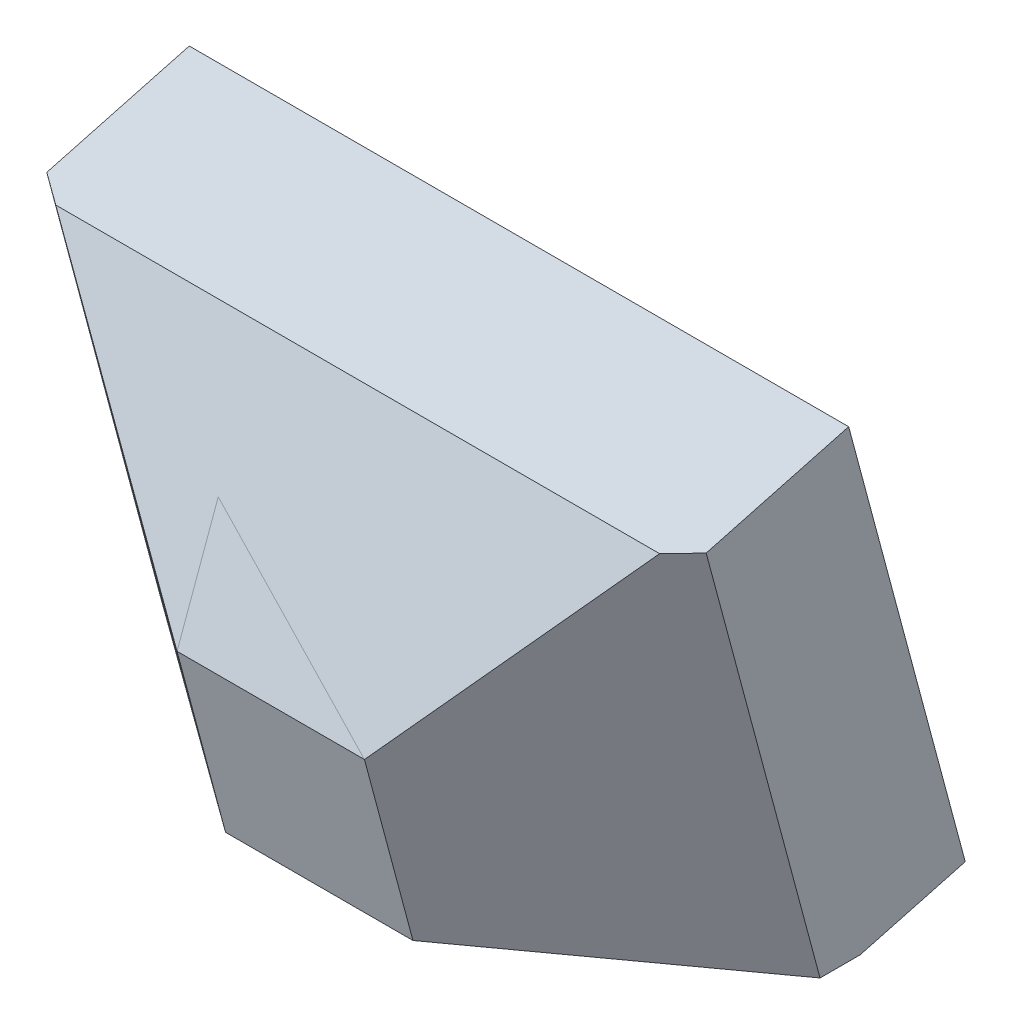
ISO-10303-21;
HEADER;
FILE_DESCRIPTION(('STEP AP214'),'2;1');
FILE_NAME('part.step','',(''),(''),'','','');
FILE_SCHEMA(('AUTOMOTIVE_DESIGN { 1 0 10303 214 1 1 1 1 }'));
ENDSEC;
DATA;
#1=APPLICATION_CONTEXT('core data for automotive mechanical design processes');
#2=APPLICATION_PROTOCOL_DEFINITION('international standard','automotive_design',2000,#1);
#3=PRODUCT_CONTEXT('',#1,'mechanical');
#4=PRODUCT('Part','Part','',(#3));
#5=PRODUCT_RELATED_PRODUCT_CATEGORY('part','',(#4));
#6=PRODUCT_DEFINITION_FORMATION('','',#4);
#7=PRODUCT_DEFINITION_CONTEXT('part definition',#1,'design');
#8=PRODUCT_DEFINITION('design','',#6,#7);
#9=PRODUCT_DEFINITION_SHAPE('','',#8);
#10=(LENGTH_UNIT() NAMED_UNIT(*) SI_UNIT(.MILLI.,.METRE.));
#11=(NAMED_UNIT(*) PLANE_ANGLE_UNIT() SI_UNIT($,.RADIAN.));
#12=(NAMED_UNIT(*) SI_UNIT($,.STERADIAN.) SOLID_ANGLE_UNIT());
#13=UNCERTAINTY_MEASURE_WITH_UNIT(LENGTH_MEASURE(1.E-05),#10,'distance_accuracy_value','');
#14=(GEOMETRIC_REPRESENTATION_CONTEXT(3) GLOBAL_UNCERTAINTY_ASSIGNED_CONTEXT((#13)) GLOBAL_UNIT_ASSIGNED_CONTEXT((#10,
#11,#12)) REPRESENTATION_CONTEXT('',''));
#15=CARTESIAN_POINT('',(0.,0.,0.));
#16=DIRECTION('',(0.,0.,1.));
#17=DIRECTION('',(1.,0.,0.));
#18=AXIS2_PLACEMENT_3D('',#15,#16,#17);
#19=CARTESIAN_POINT('',(305.,-7.24202504333624,-125.174886322785));
#20=DIRECTION('',(1.,0.,0.));
#21=DIRECTION('',(0.,0.,-1.));
#22=AXIS2_PLACEMENT_3D('',#19,#20,#21);
#23=PLANE('',#22);
#24=DIRECTION('',(0.,0.,1.));
#25=VECTOR('',#24,1.);
#26=CARTESIAN_POINT('',(305.,0.,-125.174886322785));
#27=LINE('',#26,#25);
#28=CARTESIAN_POINT('',(305.,0.,-152.202491734201));
#29=VERTEX_POINT('',#28);
#30=CARTESIAN_POINT('',(305.,0.,-123.234391560857));
#31=VERTEX_POINT('',#30);
#32=EDGE_CURVE('E197',#29,#31,#27,.T.);
#33=ORIENTED_EDGE('',*,*,#32,.F.);
#34=DIRECTION('',(0.,0.258819045102525,-0.965925826289067));
#35=VECTOR('',#34,1.);
#36=CARTESIAN_POINT('',(305.,-7.24202504333624,-125.174886322785));
#37=LINE('',#36,#35);
#38=CARTESIAN_POINT('',(305.,20.2618434910445,-227.820721097787));
#39=VERTEX_POINT('',#38);
#40=EDGE_CURVE('E176',#29,#39,#37,.T.);
#41=ORIENTED_EDGE('',*,*,#40,.T.);
#42=DIRECTION('',(0.,0.965925826289067,0.258819045102525));
#43=VECTOR('',#42,1.);
#44=CARTESIAN_POINT('',(305.,20.2618434910445,-227.820721097787));
#45=LINE('',#44,#43);
#46=CARTESIAN_POINT('',(305.,333.60132691698,-143.861659557021));
#47=VERTEX_POINT('',#46);
#48=EDGE_CURVE('E154',#39,#47,#45,.T.);
#49=ORIENTED_EDGE('',*,*,#48,.T.);
#50=DIRECTION('',(0.,0.258819045102525,-0.965925826289067));
#51=VECTOR('',#50,1.);
#52=CARTESIAN_POINT('',(305.,306.097458382599,-41.2158247820188));
#53=LINE('',#52,#51);
#54=CARTESIAN_POINT('',(305.,306.097458382599,-41.2158247820188));
#55=VERTEX_POINT('',#54);
#56=EDGE_CURVE('E193',#55,#47,#53,.T.);
#57=ORIENTED_EDGE('',*,*,#56,.F.);
#58=DIRECTION('',(0.,0.965925826289067,0.258819045102525));
#59=VECTOR('',#58,1.);
#60=CARTESIAN_POINT('',(305.,-7.24202504333624,-125.174886322785));
#61=LINE('',#60,#59);
#62=EDGE_CURVE('E146',#31,#55,#61,.T.);
#63=ORIENTED_EDGE('',*,*,#62,.F.);
#64=EDGE_LOOP('',(#33,#41,#49,#57,#63));
#65=FACE_BOUND('',#64,.T.);
#66=ADVANCED_FACE('F55',(#65),#23,.T.);
#67=CARTESIAN_POINT('',(305.,-7.24202504333624,-125.174886322785));
#68=DIRECTION('',(0.573576436351047,-0.212012149896658,0.791240115236222));
#69=DIRECTION('',(0.809645768037899,0.,-0.586918844729253));
#70=AXIS2_PLACEMENT_3D('',#67,#68,#69);
#71=PLANE('',#70);
#72=DIRECTION('',(0.633687274224638,0.726936177021562,-0.264583130647107));
#73=VECTOR('',#72,1.);
#74=CARTESIAN_POINT('',(166.705736652655,166.771313431254,21.7024907229435));
#75=LINE('',#74,#73);
#76=CARTESIAN_POINT('',(135.,130.399986549024,34.9405710888409));
#77=VERTEX_POINT('',#76);
#78=CARTESIAN_POINT('',(284.999999999998,302.472917454338,-27.6888538836363));
#79=VERTEX_POINT('',#78);
#80=EDGE_CURVE('E69',#77,#79,#75,.T.);
#81=ORIENTED_EDGE('',*,*,#80,.F.);
#82=DIRECTION('',(0.,0.965925826289067,0.258819045102525));
#83=VECTOR('',#82,1.);
#84=CARTESIAN_POINT('',(135.,-38.0506229335509,-10.1956336865463));
#85=LINE('',#84,#83);
#86=CARTESIAN_POINT('',(135.,0.,0.));
#87=VERTEX_POINT('',#86);
#88=EDGE_CURVE('E134',#87,#77,#85,.T.);
#89=ORIENTED_EDGE('',*,*,#88,.F.);
#90=DIRECTION('',(-0.809645768037899,0.,0.586918844729253));
#91=VECTOR('',#90,1.);
#92=CARTESIAN_POINT('',(305.922116045171,0.,-123.902841030122));
#93=LINE('',#92,#91);
#94=EDGE_CURVE('E200',#31,#87,#93,.T.);
#95=ORIENTED_EDGE('',*,*,#94,.F.);
#96=ORIENTED_EDGE('',*,*,#62,.T.);
#97=DIRECTION('',(0.819152044288991,0.148452505549687,-0.554032293222324));
#98=VECTOR('',#97,1.);
#99=CARTESIAN_POINT('',(305.,306.097458382599,-41.2158247820188));
#100=LINE('',#99,#98);
#101=EDGE_CURVE('E179',#79,#55,#100,.T.);
#102=ORIENTED_EDGE('',*,*,#101,.F.);
#103=EDGE_LOOP('',(#81,#89,#95,#96,#102));
#104=FACE_BOUND('',#103,.T.);
#105=ADVANCED_FACE('F225',(#104),#71,.T.);
#106=CARTESIAN_POINT('',(135.,-38.0506229335509,-10.1956336865463));
#107=DIRECTION('',(0.,-0.258819045102525,0.965925826289067));
#108=DIRECTION('',(0.,-0.965925826289067,-0.258819045102525));
#109=AXIS2_PLACEMENT_3D('',#106,#107,#108);
#110=PLANE('',#109);
#111=DIRECTION('',(1.,0.,0.));
#112=VECTOR('',#111,1.);
#113=CARTESIAN_POINT('',(-170.,130.399986549024,34.9405710888409));
#114=LINE('',#113,#112);
#115=CARTESIAN_POINT('',(0.,130.399986549024,34.9405710888409));
#116=VERTEX_POINT('',#115);
#117=EDGE_CURVE('E120',#116,#77,#114,.T.);
#118=ORIENTED_EDGE('',*,*,#117,.F.);
#119=DIRECTION('',(0.,0.965925826289067,0.258819045102525));
#120=VECTOR('',#119,1.);
#121=CARTESIAN_POINT('',(0.,-38.0506229335509,-10.1956336865463));
#122=LINE('',#121,#120);
#123=CARTESIAN_POINT('',(0.,0.,0.));
#124=VERTEX_POINT('',#123);
#125=EDGE_CURVE('E132',#124,#116,#122,.T.);
#126=ORIENTED_EDGE('',*,*,#125,.F.);
#127=DIRECTION('',(-1.,0.,0.));
#128=VECTOR('',#127,1.);
#129=CARTESIAN_POINT('',(135.,0.,0.));
#130=LINE('',#129,#128);
#131=EDGE_CURVE('E203',#87,#124,#130,.T.);
#132=ORIENTED_EDGE('',*,*,#131,.F.);
#133=ORIENTED_EDGE('',*,*,#88,.T.);
#134=EDGE_LOOP('',(#118,#126,#132,#133));
#135=FACE_BOUND('',#134,.T.);
#136=ADVANCED_FACE('F130',(#135),#110,.T.);
#137=CARTESIAN_POINT('',(0.,-38.0506229335509,-10.1956336865463));
#138=DIRECTION('',(-0.573576436351047,-0.212012149896658,0.791240115236222));
#139=DIRECTION('',(0.809645768037899,0.,0.586918844729253));
#140=AXIS2_PLACEMENT_3D('',#137,#138,#139);
#141=PLANE('',#140);
#142=DIRECTION('',(0.633687274224638,-0.726936177021562,0.264583130647107));
#143=VECTOR('',#142,1.);
#144=CARTESIAN_POINT('',(70.0291378899202,50.06585984575,64.1798020046014));
#145=LINE('',#144,#143);
#146=CARTESIAN_POINT('',(-149.999999999998,302.472917454338,-27.6888538836363));
#147=VERTEX_POINT('',#146);
#148=EDGE_CURVE('E117',#147,#116,#145,.T.);
#149=ORIENTED_EDGE('',*,*,#148,.F.);
#150=DIRECTION('',(0.819152044288991,-0.148452505549687,0.554032293222324));
#151=VECTOR('',#150,1.);
#152=CARTESIAN_POINT('',(0.,275.288860492384,73.7634278542196));
#153=LINE('',#152,#151);
#154=CARTESIAN_POINT('',(-170.,306.097458382599,-41.2158247820189));
#155=VERTEX_POINT('',#154);
#156=EDGE_CURVE('E182',#155,#147,#153,.T.);
#157=ORIENTED_EDGE('',*,*,#156,.F.);
#158=DIRECTION('',(0.,0.965925826289067,0.258819045102525));
#159=VECTOR('',#158,1.);
#160=CARTESIAN_POINT('',(-170.,-7.24202504333624,-125.174886322785));
#161=LINE('',#160,#159);
#162=CARTESIAN_POINT('',(-170.,0.,-123.234391560857));
#163=VERTEX_POINT('',#162);
#164=EDGE_CURVE('E142',#163,#155,#161,.T.);
#165=ORIENTED_EDGE('',*,*,#164,.F.);
#166=DIRECTION('',(-0.809645768037899,0.,-0.586918844729253));
#167=VECTOR('',#166,1.);
#168=CARTESIAN_POINT('',(-4.84492800367602,0.,-3.51212796875981));
#169=LINE('',#168,#167);
#170=EDGE_CURVE('E140',#124,#163,#169,.T.);
#171=ORIENTED_EDGE('',*,*,#170,.F.);
#172=ORIENTED_EDGE('',*,*,#125,.T.);
#173=EDGE_LOOP('',(#149,#157,#165,#171,#172));
#174=FACE_BOUND('',#173,.T.);
#175=ADVANCED_FACE('F138',(#174),#141,.T.);
#176=CARTESIAN_POINT('',(-170.,20.2618434910445,-227.820721097787));
#177=DIRECTION('',(-1.,0.,0.));
#178=DIRECTION('',(0.,0.,1.));
#179=AXIS2_PLACEMENT_3D('',#176,#177,#178);
#180=PLANE('',#179);
#181=DIRECTION('',(0.,0.,-1.));
#182=VECTOR('',#181,1.);
#183=CARTESIAN_POINT('',(-170.,0.,-227.820721097787));
#184=LINE('',#183,#182);
#185=CARTESIAN_POINT('',(-170.,0.,-152.202491734201));
#186=VERTEX_POINT('',#185);
#187=EDGE_CURVE('E77',#163,#186,#184,.T.);
#188=ORIENTED_EDGE('',*,*,#187,.F.);
#189=ORIENTED_EDGE('',*,*,#164,.T.);
#190=DIRECTION('',(0.,-0.258819045102525,0.965925826289067));
#191=VECTOR('',#190,1.);
#192=CARTESIAN_POINT('',(-170.,333.60132691698,-143.861659557021));
#193=LINE('',#192,#191);
#194=CARTESIAN_POINT('',(-170.,333.60132691698,-143.861659557021));
#195=VERTEX_POINT('',#194);
#196=EDGE_CURVE('E185',#195,#155,#193,.T.);
#197=ORIENTED_EDGE('',*,*,#196,.F.);
#198=DIRECTION('',(0.,0.965925826289067,0.258819045102525));
#199=VECTOR('',#198,1.);
#200=CARTESIAN_POINT('',(-170.,20.2618434910445,-227.820721097787));
#201=LINE('',#200,#199);
#202=CARTESIAN_POINT('',(-170.,20.2618434910445,-227.820721097787));
#203=VERTEX_POINT('',#202);
#204=EDGE_CURVE('E148',#203,#195,#201,.T.);
#205=ORIENTED_EDGE('',*,*,#204,.F.);
#206=DIRECTION('',(0.,-0.258819045102525,0.965925826289067));
#207=VECTOR('',#206,1.);
#208=CARTESIAN_POINT('',(-170.,20.2618434910445,-227.820721097787));
#209=LINE('',#208,#207);
#210=EDGE_CURVE('E156',#203,#186,#209,.T.);
#211=ORIENTED_EDGE('',*,*,#210,.T.);
#212=EDGE_LOOP('',(#188,#189,#197,#205,#211));
#213=FACE_BOUND('',#212,.T.);
#214=ADVANCED_FACE('F213',(#213),#180,.T.);
#215=CARTESIAN_POINT('',(305.,20.2618434910445,-227.820721097787));
#216=DIRECTION('',(0.,0.258819045102525,-0.965925826289067));
#217=DIRECTION('',(0.,0.965925826289067,0.258819045102525));
#218=AXIS2_PLACEMENT_3D('',#215,#216,#217);
#219=PLANE('',#218);
#220=ORIENTED_EDGE('',*,*,#204,.T.);
#221=DIRECTION('',(-1.,0.,0.));
#222=VECTOR('',#221,1.);
#223=CARTESIAN_POINT('',(305.,333.60132691698,-143.861659557021));
#224=LINE('',#223,#222);
#225=EDGE_CURVE('E189',#47,#195,#224,.T.);
#226=ORIENTED_EDGE('',*,*,#225,.F.);
#227=ORIENTED_EDGE('',*,*,#48,.F.);
#228=DIRECTION('',(-1.,0.,0.));
#229=VECTOR('',#228,1.);
#230=CARTESIAN_POINT('',(305.,20.2618434910445,-227.820721097787));
#231=LINE('',#230,#229);
#232=EDGE_CURVE('E172',#39,#203,#231,.T.);
#233=ORIENTED_EDGE('',*,*,#232,.T.);
#234=EDGE_LOOP('',(#220,#226,#227,#233));
#235=FACE_BOUND('',#234,.T.);
#236=ADVANCED_FACE('F222',(#235),#219,.T.);
#237=CARTESIAN_POINT('',(0.,-38.0506229335508,-10.1956336865463));
#238=DIRECTION('',(0.,0.965925826289067,0.258819045102525));
#239=DIRECTION('',(0.,-0.258819045102525,0.965925826289067));
#240=AXIS2_PLACEMENT_3D('',#237,#238,#239);
#241=PLANE('',#240);
#242=ORIENTED_EDGE('',*,*,#40,.F.);
#243=DIRECTION('',(-1.,0.,0.));
#244=VECTOR('',#243,1.);
#245=CARTESIAN_POINT('',(0.,0.,-152.202491734201));
#246=LINE('',#245,#244);
#247=EDGE_CURVE('E63',#29,#186,#246,.T.);
#248=ORIENTED_EDGE('',*,*,#247,.T.);
#249=ORIENTED_EDGE('',*,*,#210,.F.);
#250=ORIENTED_EDGE('',*,*,#232,.F.);
#251=EDGE_LOOP('',(#242,#248,#249,#250));
#252=FACE_BOUND('',#251,.T.);
#253=ADVANCED_FACE('F220',(#252),#241,.F.);
#254=CARTESIAN_POINT('',(0.,275.288860492384,73.7634278542196));
#255=DIRECTION('',(0.,0.965925826289067,0.258819045102525));
#256=DIRECTION('',(0.,-0.258819045102525,0.965925826289067));
#257=AXIS2_PLACEMENT_3D('',#254,#255,#256);
#258=PLANE('',#257);
#259=DIRECTION('',(-1.,0.,0.));
#260=VECTOR('',#259,1.);
#261=CARTESIAN_POINT('',(0.,302.472917454338,-27.6888538836363));
#262=LINE('',#261,#260);
#263=EDGE_CURVE('E12',#79,#147,#262,.T.);
#264=ORIENTED_EDGE('',*,*,#263,.F.);
#265=ORIENTED_EDGE('',*,*,#101,.T.);
#266=ORIENTED_EDGE('',*,*,#56,.T.);
#267=ORIENTED_EDGE('',*,*,#225,.T.);
#268=ORIENTED_EDGE('',*,*,#196,.T.);
#269=ORIENTED_EDGE('',*,*,#156,.T.);
#270=EDGE_LOOP('',(#264,#265,#266,#267,#268,#269));
#271=FACE_BOUND('',#270,.T.);
#272=ADVANCED_FACE('F216',(#271),#258,.T.);
#273=CARTESIAN_POINT('',(0.,0.,0.));
#274=DIRECTION('',(0.,1.,0.));
#275=DIRECTION('',(0.,0.,1.));
#276=AXIS2_PLACEMENT_3D('',#273,#274,#275);
#277=PLANE('',#276);
#278=ORIENTED_EDGE('',*,*,#32,.T.);
#279=ORIENTED_EDGE('',*,*,#94,.T.);
#280=ORIENTED_EDGE('',*,*,#131,.T.);
#281=ORIENTED_EDGE('',*,*,#170,.T.);
#282=ORIENTED_EDGE('',*,*,#187,.T.);
#283=ORIENTED_EDGE('',*,*,#247,.F.);
#284=EDGE_LOOP('',(#278,#279,#280,#281,#282,#283));
#285=FACE_BOUND('',#284,.T.);
#286=ADVANCED_FACE('F211',(#285),#277,.F.);
#287=CARTESIAN_POINT('',(-170.,130.399986549024,34.9405710888409));
#288=DIRECTION('',(0.,-0.342020143325659,-0.939692620785912));
#289=DIRECTION('',(0.,0.939692620785912,-0.342020143325659));
#290=AXIS2_PLACEMENT_3D('',#287,#288,#289);
#291=PLANE('',#290);
#292=ORIENTED_EDGE('',*,*,#80,.T.);
#293=ORIENTED_EDGE('',*,*,#263,.T.);
#294=ORIENTED_EDGE('',*,*,#148,.T.);
#295=ORIENTED_EDGE('',*,*,#117,.T.);
#296=EDGE_LOOP('',(#292,#293,#294,#295));
#297=FACE_BOUND('',#296,.T.);
#298=ADVANCED_FACE('F119',(#297),#291,.F.);
#299=CLOSED_SHELL('',(#66,#105,#136,#175,#214,#236,#253,#272,#286,#298));
#300=MANIFOLD_SOLID_BREP('B2',#299);
#301=CARTESIAN_POINT('',(135.,0.,0.));
#302=DIRECTION('',(0.,1.,0.));
#303=DIRECTION('',(0.,0.,1.));
#304=AXIS2_PLACEMENT_3D('',#301,#302,#303);
#305=PLANE('',#304);
#306=DIRECTION('',(0.,0.,-1.));
#307=VECTOR('',#306,1.);
#308=CARTESIAN_POINT('',(0.,0.,0.));
#309=LINE('',#308,#307);
#310=CARTESIAN_POINT('',(0.,0.,0.));
#311=VERTEX_POINT('',#310);
#312=CARTESIAN_POINT('',(0.,0.,-152.202491734201));
#313=VERTEX_POINT('',#312);
#314=EDGE_CURVE('E381',#311,#313,#309,.T.);
#315=ORIENTED_EDGE('',*,*,#314,.T.);
#316=DIRECTION('',(-1.,0.,0.));
#317=VECTOR('',#316,1.);
#318=CARTESIAN_POINT('',(135.,0.,-152.202491734201));
#319=LINE('',#318,#317);
#320=CARTESIAN_POINT('',(135.,0.,-152.202491734201));
#321=VERTEX_POINT('',#320);
#322=EDGE_CURVE('E53',#321,#313,#319,.T.);
#323=ORIENTED_EDGE('',*,*,#322,.F.);
#324=DIRECTION('',(0.,0.,-1.));
#325=VECTOR('',#324,1.);
#326=CARTESIAN_POINT('',(135.,0.,0.));
#327=LINE('',#326,#325);
#328=CARTESIAN_POINT('',(135.,0.,0.));
#329=VERTEX_POINT('',#328);
#330=EDGE_CURVE('E389',#329,#321,#327,.T.);
#331=ORIENTED_EDGE('',*,*,#330,.F.);
#332=DIRECTION('',(-1.,0.,0.));
#333=VECTOR('',#332,1.);
#334=CARTESIAN_POINT('',(135.,0.,0.));
#335=LINE('',#334,#333);
#336=EDGE_CURVE('E377',#329,#311,#335,.T.);
#337=ORIENTED_EDGE('',*,*,#336,.T.);
#338=EDGE_LOOP('',(#315,#323,#331,#337));
#339=FACE_BOUND('',#338,.T.);
#340=ADVANCED_FACE('F307',(#339),#305,.F.);
#341=CARTESIAN_POINT('',(135.,302.472917454338,-152.202491734201));
#342=DIRECTION('',(0.,0.,1.));
#343=DIRECTION('',(0.,-1.,0.));
#344=AXIS2_PLACEMENT_3D('',#341,#342,#343);
#345=PLANE('',#344);
#346=DIRECTION('',(0.,1.,0.));
#347=VECTOR('',#346,1.);
#348=CARTESIAN_POINT('',(0.,302.472917454338,-152.202491734201));
#349=LINE('',#348,#347);
#350=CARTESIAN_POINT('',(0.,302.472917454338,-152.202491734201));
#351=VERTEX_POINT('',#350);
#352=EDGE_CURVE('E384',#313,#351,#349,.T.);
#353=ORIENTED_EDGE('',*,*,#352,.T.);
#354=DIRECTION('',(-1.,0.,0.));
#355=VECTOR('',#354,1.);
#356=CARTESIAN_POINT('',(135.,302.472917454338,-152.202491734201));
#357=LINE('',#356,#355);
#358=CARTESIAN_POINT('',(135.,302.472917454338,-152.202491734201));
#359=VERTEX_POINT('',#358);
#360=EDGE_CURVE('E315',#359,#351,#357,.T.);
#361=ORIENTED_EDGE('',*,*,#360,.F.);
#362=DIRECTION('',(0.,1.,0.));
#363=VECTOR('',#362,1.);
#364=CARTESIAN_POINT('',(135.,302.472917454338,-152.202491734201));
#365=LINE('',#364,#363);
#366=EDGE_CURVE('E357',#321,#359,#365,.T.);
#367=ORIENTED_EDGE('',*,*,#366,.F.);
#368=ORIENTED_EDGE('',*,*,#322,.T.);
#369=EDGE_LOOP('',(#353,#361,#367,#368));
#370=FACE_BOUND('',#369,.T.);
#371=ADVANCED_FACE('F408',(#370),#345,.F.);
#372=CARTESIAN_POINT('',(135.,302.472917454338,-27.6888538836378));
#373=DIRECTION('',(0.,-1.,0.));
#374=DIRECTION('',(0.,0.,-1.));
#375=AXIS2_PLACEMENT_3D('',#372,#373,#374);
#376=PLANE('',#375);
#377=DIRECTION('',(0.,0.,1.));
#378=VECTOR('',#377,1.);
#379=CARTESIAN_POINT('',(0.,302.472917454338,-27.6888538836378));
#380=LINE('',#379,#378);
#381=CARTESIAN_POINT('',(0.,302.472917454338,-27.6888538836378));
#382=VERTEX_POINT('',#381);
#383=EDGE_CURVE('E372',#351,#382,#380,.T.);
#384=ORIENTED_EDGE('',*,*,#383,.T.);
#385=DIRECTION('',(-1.,0.,0.));
#386=VECTOR('',#385,1.);
#387=CARTESIAN_POINT('',(135.,302.472917454338,-27.6888538836378));
#388=LINE('',#387,#386);
#389=CARTESIAN_POINT('',(135.,302.472917454338,-27.6888538836378));
#390=VERTEX_POINT('',#389);
#391=EDGE_CURVE('E369',#390,#382,#388,.T.);
#392=ORIENTED_EDGE('',*,*,#391,.F.);
#393=DIRECTION('',(0.,0.,1.));
#394=VECTOR('',#393,1.);
#395=CARTESIAN_POINT('',(135.,302.472917454338,-27.6888538836378));
#396=LINE('',#395,#394);
#397=EDGE_CURVE('E361',#359,#390,#396,.T.);
#398=ORIENTED_EDGE('',*,*,#397,.F.);
#399=ORIENTED_EDGE('',*,*,#360,.T.);
#400=EDGE_LOOP('',(#384,#392,#398,#399));
#401=FACE_BOUND('',#400,.T.);
#402=ADVANCED_FACE('F370',(#401),#376,.F.);
#403=CARTESIAN_POINT('',(135.,130.399986549024,34.9405710888409));
#404=DIRECTION('',(0.,-0.342020143325666,-0.939692620785909));
#405=DIRECTION('',(0.,0.939692620785909,-0.342020143325666));
#406=AXIS2_PLACEMENT_3D('',#403,#404,#405);
#407=PLANE('',#406);
#408=DIRECTION('',(0.,-0.939692620785909,0.342020143325666));
#409=VECTOR('',#408,1.);
#410=CARTESIAN_POINT('',(0.,130.399986549024,34.9405710888409));
#411=LINE('',#410,#409);
#412=CARTESIAN_POINT('',(0.,130.399986549024,34.9405710888409));
#413=VERTEX_POINT('',#412);
#414=EDGE_CURVE('E343',#382,#413,#411,.T.);
#415=ORIENTED_EDGE('',*,*,#414,.T.);
#416=DIRECTION('',(-1.,0.,0.));
#417=VECTOR('',#416,1.);
#418=CARTESIAN_POINT('',(135.,130.399986549024,34.9405710888409));
#419=LINE('',#418,#417);
#420=CARTESIAN_POINT('',(135.,130.399986549024,34.9405710888409));
#421=VERTEX_POINT('',#420);
#422=EDGE_CURVE('E373',#421,#413,#419,.T.);
#423=ORIENTED_EDGE('',*,*,#422,.F.);
#424=DIRECTION('',(0.,-0.939692620785909,0.342020143325666));
#425=VECTOR('',#424,1.);
#426=CARTESIAN_POINT('',(135.,130.399986549024,34.9405710888409));
#427=LINE('',#426,#425);
#428=EDGE_CURVE('E365',#390,#421,#427,.T.);
#429=ORIENTED_EDGE('',*,*,#428,.F.);
#430=ORIENTED_EDGE('',*,*,#391,.T.);
#431=EDGE_LOOP('',(#415,#423,#429,#430));
#432=FACE_BOUND('',#431,.T.);
#433=ADVANCED_FACE('F375',(#432),#407,.F.);
#434=CARTESIAN_POINT('',(135.,0.,0.));
#435=DIRECTION('',(0.,0.258819045102525,-0.965925826289067));
#436=DIRECTION('',(0.,0.965925826289067,0.258819045102525));
#437=AXIS2_PLACEMENT_3D('',#434,#435,#436);
#438=PLANE('',#437);
#439=DIRECTION('',(0.,-0.965925826289067,-0.258819045102525));
#440=VECTOR('',#439,1.);
#441=CARTESIAN_POINT('',(0.,0.,0.));
#442=LINE('',#441,#440);
#443=EDGE_CURVE('E349',#413,#311,#442,.T.);
#444=ORIENTED_EDGE('',*,*,#443,.T.);
#445=ORIENTED_EDGE('',*,*,#336,.F.);
#446=DIRECTION('',(0.,-0.965925826289067,-0.258819045102525));
#447=VECTOR('',#446,1.);
#448=CARTESIAN_POINT('',(135.,0.,0.));
#449=LINE('',#448,#447);
#450=EDGE_CURVE('E323',#421,#329,#449,.T.);
#451=ORIENTED_EDGE('',*,*,#450,.F.);
#452=ORIENTED_EDGE('',*,*,#422,.T.);
#453=EDGE_LOOP('',(#444,#445,#451,#452));
#454=FACE_BOUND('',#453,.T.);
#455=ADVANCED_FACE('F397',(#454),#438,.F.);
#456=CARTESIAN_POINT('',(135.,0.,0.));
#457=DIRECTION('',(-1.,0.,0.));
#458=DIRECTION('',(0.,0.,1.));
#459=AXIS2_PLACEMENT_3D('',#456,#457,#458);
#460=PLANE('',#459);
#461=ORIENTED_EDGE('',*,*,#330,.T.);
#462=ORIENTED_EDGE('',*,*,#366,.T.);
#463=ORIENTED_EDGE('',*,*,#397,.T.);
#464=ORIENTED_EDGE('',*,*,#428,.T.);
#465=ORIENTED_EDGE('',*,*,#450,.T.);
#466=EDGE_LOOP('',(#461,#462,#463,#464,#465));
#467=FACE_BOUND('',#466,.T.);
#468=ADVANCED_FACE('F363',(#467),#460,.F.);
#469=CARTESIAN_POINT('',(0.,0.,0.));
#470=DIRECTION('',(-1.,0.,0.));
#471=DIRECTION('',(0.,0.,1.));
#472=AXIS2_PLACEMENT_3D('',#469,#470,#471);
#473=PLANE('',#472);
#474=ORIENTED_EDGE('',*,*,#314,.F.);
#475=ORIENTED_EDGE('',*,*,#443,.F.);
#476=ORIENTED_EDGE('',*,*,#414,.F.);
#477=ORIENTED_EDGE('',*,*,#383,.F.);
#478=ORIENTED_EDGE('',*,*,#352,.F.);
#479=EDGE_LOOP('',(#474,#475,#476,#477,#478));
#480=FACE_BOUND('',#479,.T.);
#481=ADVANCED_FACE('F393',(#480),#473,.T.);
#482=CLOSED_SHELL('',(#340,#371,#402,#433,#455,#468,#481));
#483=MANIFOLD_SOLID_BREP('B6',#482);
#484=ADVANCED_BREP_SHAPE_REPRESENTATION('',(#18,#300,#483),#14);
#485=SHAPE_DEFINITION_REPRESENTATION(#9,#484);
ENDSEC;
END-ISO-10303-21;
